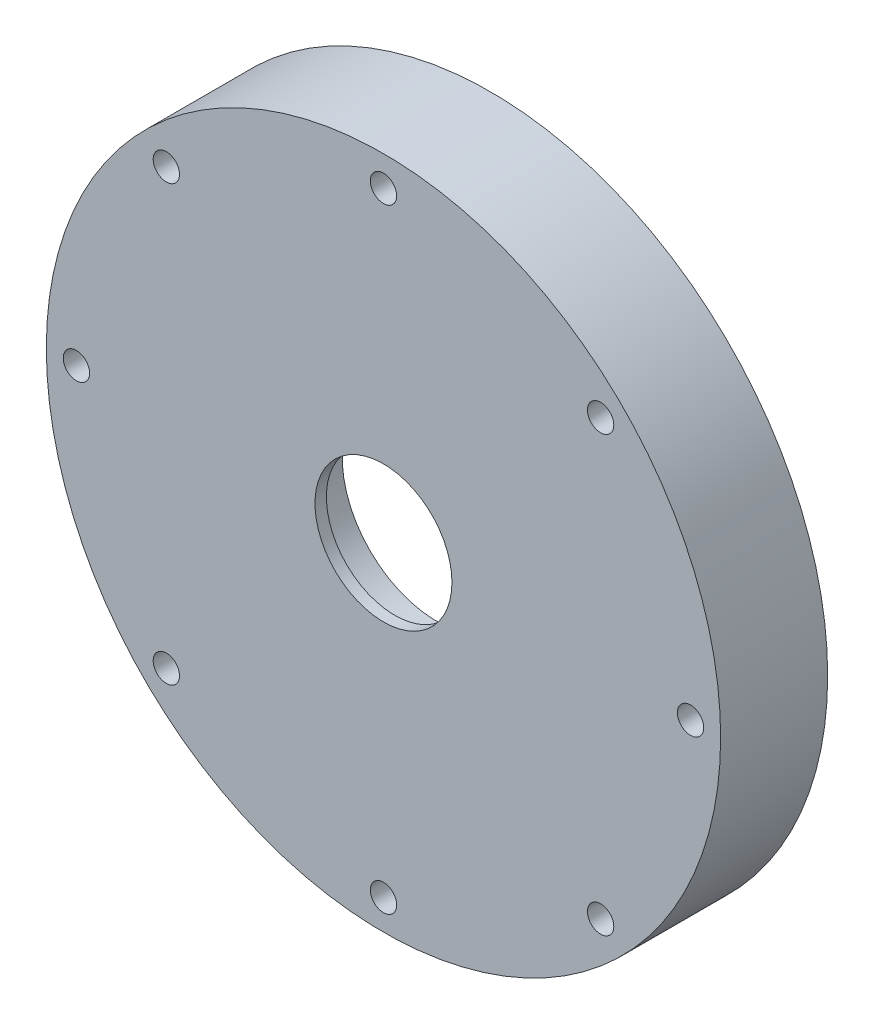
ISO-10303-21;
HEADER;
FILE_DESCRIPTION(('STEP AP214'),'2;1');
FILE_NAME('part.step','',(''),(''),'','','');
FILE_SCHEMA(('AUTOMOTIVE_DESIGN { 1 0 10303 214 1 1 1 1 }'));
ENDSEC;
DATA;
#1=APPLICATION_CONTEXT('core data for automotive mechanical design processes');
#2=APPLICATION_PROTOCOL_DEFINITION('international standard','automotive_design',2000,#1);
#3=PRODUCT_CONTEXT('',#1,'mechanical');
#4=PRODUCT('Part','Part','',(#3));
#5=PRODUCT_RELATED_PRODUCT_CATEGORY('part','',(#4));
#6=PRODUCT_DEFINITION_FORMATION('','',#4);
#7=PRODUCT_DEFINITION_CONTEXT('part definition',#1,'design');
#8=PRODUCT_DEFINITION('design','',#6,#7);
#9=PRODUCT_DEFINITION_SHAPE('','',#8);
#10=(LENGTH_UNIT() NAMED_UNIT(*) SI_UNIT(.MILLI.,.METRE.));
#11=(NAMED_UNIT(*) PLANE_ANGLE_UNIT() SI_UNIT($,.RADIAN.));
#12=(NAMED_UNIT(*) SI_UNIT($,.STERADIAN.) SOLID_ANGLE_UNIT());
#13=UNCERTAINTY_MEASURE_WITH_UNIT(LENGTH_MEASURE(1.E-05),#10,'distance_accuracy_value','');
#14=(GEOMETRIC_REPRESENTATION_CONTEXT(3) GLOBAL_UNCERTAINTY_ASSIGNED_CONTEXT((#13)) GLOBAL_UNIT_ASSIGNED_CONTEXT((#10,
#11,#12)) REPRESENTATION_CONTEXT('',''));
#15=CARTESIAN_POINT('',(0.,0.,0.));
#16=DIRECTION('',(0.,0.,1.));
#17=DIRECTION('',(1.,0.,0.));
#18=AXIS2_PLACEMENT_3D('',#15,#16,#17);
#19=CARTESIAN_POINT('',(0.,0.,-10.16));
#20=DIRECTION('',(0.,0.,1.));
#21=DIRECTION('',(-1.,0.,0.));
#22=AXIS2_PLACEMENT_3D('',#19,#20,#21);
#23=CYLINDRICAL_SURFACE('',#22,32.004);
#24=CARTESIAN_POINT('',(0.,0.,-10.16));
#25=DIRECTION('',(0.,0.,1.));
#26=DIRECTION('',(1.,0.,0.));
#27=AXIS2_PLACEMENT_3D('',#24,#25,#26);
#28=CIRCLE('',#27,32.004);
#29=CARTESIAN_POINT('',(32.004,0.,-10.16));
#30=VERTEX_POINT('',#29);
#31=EDGE_CURVE('E10',#30,#30,#28,.T.);
#32=ORIENTED_EDGE('',*,*,#31,.T.);
#33=EDGE_LOOP('',(#32));
#34=FACE_BOUND('',#33,.T.);
#35=CARTESIAN_POINT('',(0.,0.,0.));
#36=DIRECTION('',(0.,0.,1.));
#37=DIRECTION('',(1.,0.,0.));
#38=AXIS2_PLACEMENT_3D('',#35,#36,#37);
#39=CIRCLE('',#38,32.004);
#40=CARTESIAN_POINT('',(32.004,0.,0.));
#41=VERTEX_POINT('',#40);
#42=EDGE_CURVE('E48',#41,#41,#39,.T.);
#43=ORIENTED_EDGE('',*,*,#42,.F.);
#44=EDGE_LOOP('',(#43));
#45=FACE_BOUND('',#44,.T.);
#46=ADVANCED_FACE('F45',(#34,#45),#23,.T.);
#47=CARTESIAN_POINT('',(0.,0.,-10.16));
#48=DIRECTION('',(0.,0.,-1.));
#49=DIRECTION('',(1.,0.,0.));
#50=AXIS2_PLACEMENT_3D('',#47,#48,#49);
#51=PLANE('',#50);
#52=CARTESIAN_POINT('',(0.,29.1465,-10.16));
#53=DIRECTION('',(0.,0.,1.));
#54=DIRECTION('',(1.,0.,0.));
#55=AXIS2_PLACEMENT_3D('',#52,#53,#54);
#56=CIRCLE('',#55,1.25);
#57=CARTESIAN_POINT('',(1.25,29.1465,-10.16));
#58=VERTEX_POINT('',#57);
#59=EDGE_CURVE('E119',#58,#58,#56,.T.);
#60=ORIENTED_EDGE('',*,*,#59,.T.);
#61=EDGE_LOOP('',(#60));
#62=FACE_BOUND('',#61,.T.);
#63=CARTESIAN_POINT('',(20.6096877978537,20.6096877978537,-10.16));
#64=DIRECTION('',(0.,0.,1.));
#65=DIRECTION('',(1.,0.,0.));
#66=AXIS2_PLACEMENT_3D('',#63,#64,#65);
#67=CIRCLE('',#66,1.25);
#68=CARTESIAN_POINT('',(21.8596877978537,20.6096877978537,-10.16));
#69=VERTEX_POINT('',#68);
#70=EDGE_CURVE('E113',#69,#69,#67,.T.);
#71=ORIENTED_EDGE('',*,*,#70,.T.);
#72=EDGE_LOOP('',(#71));
#73=FACE_BOUND('',#72,.T.);
#74=CARTESIAN_POINT('',(29.1465,0.,-10.16));
#75=DIRECTION('',(0.,0.,1.));
#76=DIRECTION('',(1.,0.,0.));
#77=AXIS2_PLACEMENT_3D('',#74,#75,#76);
#78=CIRCLE('',#77,1.25);
#79=CARTESIAN_POINT('',(30.3965,0.,-10.16));
#80=VERTEX_POINT('',#79);
#81=EDGE_CURVE('E107',#80,#80,#78,.T.);
#82=ORIENTED_EDGE('',*,*,#81,.T.);
#83=EDGE_LOOP('',(#82));
#84=FACE_BOUND('',#83,.T.);
#85=CARTESIAN_POINT('',(20.6096877978537,-20.6096877978537,-10.16));
#86=DIRECTION('',(0.,0.,1.));
#87=DIRECTION('',(1.,0.,0.));
#88=AXIS2_PLACEMENT_3D('',#85,#86,#87);
#89=CIRCLE('',#88,1.25);
#90=CARTESIAN_POINT('',(21.8596877978537,-20.6096877978537,-10.16));
#91=VERTEX_POINT('',#90);
#92=EDGE_CURVE('E101',#91,#91,#89,.T.);
#93=ORIENTED_EDGE('',*,*,#92,.T.);
#94=EDGE_LOOP('',(#93));
#95=FACE_BOUND('',#94,.T.);
#96=CARTESIAN_POINT('',(0.,-29.1465,-10.16));
#97=DIRECTION('',(0.,0.,1.));
#98=DIRECTION('',(1.,0.,0.));
#99=AXIS2_PLACEMENT_3D('',#96,#97,#98);
#100=CIRCLE('',#99,1.25);
#101=CARTESIAN_POINT('',(1.25,-29.1465,-10.16));
#102=VERTEX_POINT('',#101);
#103=EDGE_CURVE('E95',#102,#102,#100,.T.);
#104=ORIENTED_EDGE('',*,*,#103,.T.);
#105=EDGE_LOOP('',(#104));
#106=FACE_BOUND('',#105,.T.);
#107=CARTESIAN_POINT('',(-20.6096877978537,-20.6096877978537,-10.16));
#108=DIRECTION('',(0.,0.,1.));
#109=DIRECTION('',(1.,0.,0.));
#110=AXIS2_PLACEMENT_3D('',#107,#108,#109);
#111=CIRCLE('',#110,1.25);
#112=CARTESIAN_POINT('',(-19.3596877978537,-20.6096877978537,-10.16));
#113=VERTEX_POINT('',#112);
#114=EDGE_CURVE('E89',#113,#113,#111,.T.);
#115=ORIENTED_EDGE('',*,*,#114,.T.);
#116=EDGE_LOOP('',(#115));
#117=FACE_BOUND('',#116,.T.);
#118=CARTESIAN_POINT('',(-29.1465,0.,-10.16));
#119=DIRECTION('',(0.,0.,1.));
#120=DIRECTION('',(1.,0.,0.));
#121=AXIS2_PLACEMENT_3D('',#118,#119,#120);
#122=CIRCLE('',#121,1.25);
#123=CARTESIAN_POINT('',(-27.8965,0.,-10.16));
#124=VERTEX_POINT('',#123);
#125=EDGE_CURVE('E83',#124,#124,#122,.T.);
#126=ORIENTED_EDGE('',*,*,#125,.T.);
#127=EDGE_LOOP('',(#126));
#128=FACE_BOUND('',#127,.T.);
#129=CARTESIAN_POINT('',(-20.6096877978537,20.6096877978537,-10.16));
#130=DIRECTION('',(0.,0.,1.));
#131=DIRECTION('',(1.,0.,0.));
#132=AXIS2_PLACEMENT_3D('',#129,#130,#131);
#133=CIRCLE('',#132,1.25);
#134=CARTESIAN_POINT('',(-19.3596877978537,20.6096877978537,-10.16));
#135=VERTEX_POINT('',#134);
#136=EDGE_CURVE('E77',#135,#135,#133,.T.);
#137=ORIENTED_EDGE('',*,*,#136,.T.);
#138=EDGE_LOOP('',(#137));
#139=FACE_BOUND('',#138,.T.);
#140=CARTESIAN_POINT('',(0.,0.,-10.16));
#141=DIRECTION('',(0.,0.,1.));
#142=DIRECTION('',(1.,0.,0.));
#143=AXIS2_PLACEMENT_3D('',#140,#141,#142);
#144=CIRCLE('',#143,25.4);
#145=CARTESIAN_POINT('',(25.4,0.,-10.16));
#146=VERTEX_POINT('',#145);
#147=EDGE_CURVE('E57',#146,#146,#144,.T.);
#148=ORIENTED_EDGE('',*,*,#147,.T.);
#149=EDGE_LOOP('',(#148));
#150=FACE_BOUND('',#149,.T.);
#151=ORIENTED_EDGE('',*,*,#31,.F.);
#152=EDGE_LOOP('',(#151));
#153=FACE_BOUND('',#152,.T.);
#154=ADVANCED_FACE('F123',(#62,#73,#84,#95,#106,#117,#128,#139,#150,#153),#51,.T.);
#155=CARTESIAN_POINT('',(0.,0.,0.));
#156=DIRECTION('',(0.,0.,-1.));
#157=DIRECTION('',(1.,0.,0.));
#158=AXIS2_PLACEMENT_3D('',#155,#156,#157);
#159=PLANE('',#158);
#160=CARTESIAN_POINT('',(0.,29.1465,0.));
#161=DIRECTION('',(0.,0.,1.));
#162=DIRECTION('',(1.,0.,0.));
#163=AXIS2_PLACEMENT_3D('',#160,#161,#162);
#164=CIRCLE('',#163,1.25);
#165=CARTESIAN_POINT('',(1.25,29.1465,0.));
#166=VERTEX_POINT('',#165);
#167=EDGE_CURVE('E116',#166,#166,#164,.T.);
#168=ORIENTED_EDGE('',*,*,#167,.F.);
#169=EDGE_LOOP('',(#168));
#170=FACE_BOUND('',#169,.T.);
#171=CARTESIAN_POINT('',(20.6096877978537,20.6096877978537,0.));
#172=DIRECTION('',(0.,0.,1.));
#173=DIRECTION('',(1.,0.,0.));
#174=AXIS2_PLACEMENT_3D('',#171,#172,#173);
#175=CIRCLE('',#174,1.25);
#176=CARTESIAN_POINT('',(21.8596877978537,20.6096877978537,0.));
#177=VERTEX_POINT('',#176);
#178=EDGE_CURVE('E110',#177,#177,#175,.T.);
#179=ORIENTED_EDGE('',*,*,#178,.F.);
#180=EDGE_LOOP('',(#179));
#181=FACE_BOUND('',#180,.T.);
#182=CARTESIAN_POINT('',(29.1465,0.,0.));
#183=DIRECTION('',(0.,0.,1.));
#184=DIRECTION('',(1.,0.,0.));
#185=AXIS2_PLACEMENT_3D('',#182,#183,#184);
#186=CIRCLE('',#185,1.25);
#187=CARTESIAN_POINT('',(30.3965,0.,0.));
#188=VERTEX_POINT('',#187);
#189=EDGE_CURVE('E104',#188,#188,#186,.T.);
#190=ORIENTED_EDGE('',*,*,#189,.F.);
#191=EDGE_LOOP('',(#190));
#192=FACE_BOUND('',#191,.T.);
#193=CARTESIAN_POINT('',(20.6096877978537,-20.6096877978537,0.));
#194=DIRECTION('',(0.,0.,1.));
#195=DIRECTION('',(1.,0.,0.));
#196=AXIS2_PLACEMENT_3D('',#193,#194,#195);
#197=CIRCLE('',#196,1.25);
#198=CARTESIAN_POINT('',(21.8596877978537,-20.6096877978537,0.));
#199=VERTEX_POINT('',#198);
#200=EDGE_CURVE('E98',#199,#199,#197,.T.);
#201=ORIENTED_EDGE('',*,*,#200,.F.);
#202=EDGE_LOOP('',(#201));
#203=FACE_BOUND('',#202,.T.);
#204=CARTESIAN_POINT('',(0.,-29.1465,0.));
#205=DIRECTION('',(0.,0.,1.));
#206=DIRECTION('',(1.,0.,0.));
#207=AXIS2_PLACEMENT_3D('',#204,#205,#206);
#208=CIRCLE('',#207,1.25);
#209=CARTESIAN_POINT('',(1.25,-29.1465,0.));
#210=VERTEX_POINT('',#209);
#211=EDGE_CURVE('E92',#210,#210,#208,.T.);
#212=ORIENTED_EDGE('',*,*,#211,.F.);
#213=EDGE_LOOP('',(#212));
#214=FACE_BOUND('',#213,.T.);
#215=CARTESIAN_POINT('',(-20.6096877978537,-20.6096877978537,0.));
#216=DIRECTION('',(0.,0.,1.));
#217=DIRECTION('',(1.,0.,0.));
#218=AXIS2_PLACEMENT_3D('',#215,#216,#217);
#219=CIRCLE('',#218,1.25);
#220=CARTESIAN_POINT('',(-19.3596877978537,-20.6096877978537,0.));
#221=VERTEX_POINT('',#220);
#222=EDGE_CURVE('E86',#221,#221,#219,.T.);
#223=ORIENTED_EDGE('',*,*,#222,.F.);
#224=EDGE_LOOP('',(#223));
#225=FACE_BOUND('',#224,.T.);
#226=CARTESIAN_POINT('',(-29.1465,0.,0.));
#227=DIRECTION('',(0.,0.,1.));
#228=DIRECTION('',(1.,0.,0.));
#229=AXIS2_PLACEMENT_3D('',#226,#227,#228);
#230=CIRCLE('',#229,1.25);
#231=CARTESIAN_POINT('',(-27.8965,0.,0.));
#232=VERTEX_POINT('',#231);
#233=EDGE_CURVE('E80',#232,#232,#230,.T.);
#234=ORIENTED_EDGE('',*,*,#233,.F.);
#235=EDGE_LOOP('',(#234));
#236=FACE_BOUND('',#235,.T.);
#237=CARTESIAN_POINT('',(-20.6096877978537,20.6096877978537,0.));
#238=DIRECTION('',(0.,0.,1.));
#239=DIRECTION('',(1.,0.,0.));
#240=AXIS2_PLACEMENT_3D('',#237,#238,#239);
#241=CIRCLE('',#240,1.25);
#242=CARTESIAN_POINT('',(-19.3596877978537,20.6096877978537,0.));
#243=VERTEX_POINT('',#242);
#244=EDGE_CURVE('E72',#243,#243,#241,.T.);
#245=ORIENTED_EDGE('',*,*,#244,.F.);
#246=EDGE_LOOP('',(#245));
#247=FACE_BOUND('',#246,.T.);
#248=CARTESIAN_POINT('',(0.,0.,0.));
#249=DIRECTION('',(0.,0.,1.));
#250=DIRECTION('',(1.,0.,0.));
#251=AXIS2_PLACEMENT_3D('',#248,#249,#250);
#252=CIRCLE('',#251,6.5);
#253=CARTESIAN_POINT('',(6.5,0.,0.));
#254=VERTEX_POINT('',#253);
#255=EDGE_CURVE('E66',#254,#254,#252,.T.);
#256=ORIENTED_EDGE('',*,*,#255,.F.);
#257=EDGE_LOOP('',(#256));
#258=FACE_BOUND('',#257,.T.);
#259=ORIENTED_EDGE('',*,*,#42,.T.);
#260=EDGE_LOOP('',(#259));
#261=FACE_BOUND('',#260,.T.);
#262=ADVANCED_FACE('F144',(#170,#181,#192,#203,#214,#225,#236,#247,#258,#261),#159,.F.);
#263=CARTESIAN_POINT('',(0.,0.,-5.08));
#264=DIRECTION('',(0.,0.,-1.));
#265=DIRECTION('',(1.,0.,0.));
#266=AXIS2_PLACEMENT_3D('',#263,#264,#265);
#267=CYLINDRICAL_SURFACE('',#266,25.4);
#268=CARTESIAN_POINT('',(0.,0.,-5.08));
#269=DIRECTION('',(0.,0.,1.));
#270=DIRECTION('',(1.,0.,0.));
#271=AXIS2_PLACEMENT_3D('',#268,#269,#270);
#272=CIRCLE('',#271,25.4);
#273=CARTESIAN_POINT('',(25.4,0.,-5.08));
#274=VERTEX_POINT('',#273);
#275=EDGE_CURVE('E55',#274,#274,#272,.T.);
#276=ORIENTED_EDGE('',*,*,#275,.T.);
#277=EDGE_LOOP('',(#276));
#278=FACE_BOUND('',#277,.T.);
#279=ORIENTED_EDGE('',*,*,#147,.F.);
#280=EDGE_LOOP('',(#279));
#281=FACE_BOUND('',#280,.T.);
#282=ADVANCED_FACE('F150',(#278,#281),#267,.F.);
#283=CARTESIAN_POINT('',(0.,0.,-5.08));
#284=DIRECTION('',(0.,0.,-1.));
#285=DIRECTION('',(1.,0.,0.));
#286=AXIS2_PLACEMENT_3D('',#283,#284,#285);
#287=PLANE('',#286);
#288=CARTESIAN_POINT('',(0.,0.,-5.08));
#289=DIRECTION('',(0.,0.,1.));
#290=DIRECTION('',(1.,0.,0.));
#291=AXIS2_PLACEMENT_3D('',#288,#289,#290);
#292=CIRCLE('',#291,9.);
#293=CARTESIAN_POINT('',(9.,0.,-5.08));
#294=VERTEX_POINT('',#293);
#295=EDGE_CURVE('E63',#294,#294,#292,.T.);
#296=ORIENTED_EDGE('',*,*,#295,.T.);
#297=EDGE_LOOP('',(#296));
#298=FACE_BOUND('',#297,.T.);
#299=ORIENTED_EDGE('',*,*,#275,.F.);
#300=EDGE_LOOP('',(#299));
#301=FACE_BOUND('',#300,.T.);
#302=ADVANCED_FACE('F155',(#298,#301),#287,.T.);
#303=CARTESIAN_POINT('',(0.,0.,-1.08));
#304=DIRECTION('',(0.,0.,-1.));
#305=DIRECTION('',(1.,0.,0.));
#306=AXIS2_PLACEMENT_3D('',#303,#304,#305);
#307=CYLINDRICAL_SURFACE('',#306,9.);
#308=CARTESIAN_POINT('',(0.,0.,-1.08));
#309=DIRECTION('',(0.,0.,1.));
#310=DIRECTION('',(1.,0.,0.));
#311=AXIS2_PLACEMENT_3D('',#308,#309,#310);
#312=CIRCLE('',#311,9.);
#313=CARTESIAN_POINT('',(9.,0.,-1.08));
#314=VERTEX_POINT('',#313);
#315=EDGE_CURVE('E60',#314,#314,#312,.T.);
#316=ORIENTED_EDGE('',*,*,#315,.T.);
#317=EDGE_LOOP('',(#316));
#318=FACE_BOUND('',#317,.T.);
#319=ORIENTED_EDGE('',*,*,#295,.F.);
#320=EDGE_LOOP('',(#319));
#321=FACE_BOUND('',#320,.T.);
#322=ADVANCED_FACE('F163',(#318,#321),#307,.F.);
#323=CARTESIAN_POINT('',(0.,0.,-1.08));
#324=DIRECTION('',(0.,0.,-1.));
#325=DIRECTION('',(1.,0.,0.));
#326=AXIS2_PLACEMENT_3D('',#323,#324,#325);
#327=PLANE('',#326);
#328=CARTESIAN_POINT('',(0.,0.,-1.08));
#329=DIRECTION('',(0.,0.,1.));
#330=DIRECTION('',(1.,0.,0.));
#331=AXIS2_PLACEMENT_3D('',#328,#329,#330);
#332=CIRCLE('',#331,6.5);
#333=CARTESIAN_POINT('',(6.5,0.,-1.08));
#334=VERTEX_POINT('',#333);
#335=EDGE_CURVE('E69',#334,#334,#332,.T.);
#336=ORIENTED_EDGE('',*,*,#335,.T.);
#337=EDGE_LOOP('',(#336));
#338=FACE_BOUND('',#337,.T.);
#339=ORIENTED_EDGE('',*,*,#315,.F.);
#340=EDGE_LOOP('',(#339));
#341=FACE_BOUND('',#340,.T.);
#342=ADVANCED_FACE('F167',(#338,#341),#327,.T.);
#343=CARTESIAN_POINT('',(0.,0.,0.));
#344=DIRECTION('',(0.,0.,-1.));
#345=DIRECTION('',(1.,0.,0.));
#346=AXIS2_PLACEMENT_3D('',#343,#344,#345);
#347=CYLINDRICAL_SURFACE('',#346,6.5);
#348=ORIENTED_EDGE('',*,*,#255,.T.);
#349=EDGE_LOOP('',(#348));
#350=FACE_BOUND('',#349,.T.);
#351=ORIENTED_EDGE('',*,*,#335,.F.);
#352=EDGE_LOOP('',(#351));
#353=FACE_BOUND('',#352,.T.);
#354=ADVANCED_FACE('F171',(#350,#353),#347,.F.);
#355=CARTESIAN_POINT('',(-20.6096877978537,20.6096877978537,-10.16));
#356=DIRECTION('',(0.,0.,-1.));
#357=DIRECTION('',(1.,0.,0.));
#358=AXIS2_PLACEMENT_3D('',#355,#356,#357);
#359=CYLINDRICAL_SURFACE('',#358,1.25);
#360=ORIENTED_EDGE('',*,*,#244,.T.);
#361=EDGE_LOOP('',(#360));
#362=FACE_BOUND('',#361,.T.);
#363=ORIENTED_EDGE('',*,*,#136,.F.);
#364=EDGE_LOOP('',(#363));
#365=FACE_BOUND('',#364,.T.);
#366=ADVANCED_FACE('F175',(#362,#365),#359,.F.);
#367=CARTESIAN_POINT('',(-29.1465,0.,-10.16));
#368=DIRECTION('',(0.,0.,-1.));
#369=DIRECTION('',(1.,0.,0.));
#370=AXIS2_PLACEMENT_3D('',#367,#368,#369);
#371=CYLINDRICAL_SURFACE('',#370,1.25);
#372=ORIENTED_EDGE('',*,*,#233,.T.);
#373=EDGE_LOOP('',(#372));
#374=FACE_BOUND('',#373,.T.);
#375=ORIENTED_EDGE('',*,*,#125,.F.);
#376=EDGE_LOOP('',(#375));
#377=FACE_BOUND('',#376,.T.);
#378=ADVANCED_FACE('F179',(#374,#377),#371,.F.);
#379=CARTESIAN_POINT('',(-20.6096877978537,-20.6096877978537,-10.16));
#380=DIRECTION('',(0.,0.,-1.));
#381=DIRECTION('',(1.,0.,0.));
#382=AXIS2_PLACEMENT_3D('',#379,#380,#381);
#383=CYLINDRICAL_SURFACE('',#382,1.25);
#384=ORIENTED_EDGE('',*,*,#222,.T.);
#385=EDGE_LOOP('',(#384));
#386=FACE_BOUND('',#385,.T.);
#387=ORIENTED_EDGE('',*,*,#114,.F.);
#388=EDGE_LOOP('',(#387));
#389=FACE_BOUND('',#388,.T.);
#390=ADVANCED_FACE('F183',(#386,#389),#383,.F.);
#391=CARTESIAN_POINT('',(0.,-29.1465,-10.16));
#392=DIRECTION('',(0.,0.,-1.));
#393=DIRECTION('',(1.,0.,0.));
#394=AXIS2_PLACEMENT_3D('',#391,#392,#393);
#395=CYLINDRICAL_SURFACE('',#394,1.25);
#396=ORIENTED_EDGE('',*,*,#211,.T.);
#397=EDGE_LOOP('',(#396));
#398=FACE_BOUND('',#397,.T.);
#399=ORIENTED_EDGE('',*,*,#103,.F.);
#400=EDGE_LOOP('',(#399));
#401=FACE_BOUND('',#400,.T.);
#402=ADVANCED_FACE('F187',(#398,#401),#395,.F.);
#403=CARTESIAN_POINT('',(20.6096877978537,-20.6096877978537,-10.16));
#404=DIRECTION('',(0.,0.,-1.));
#405=DIRECTION('',(1.,0.,0.));
#406=AXIS2_PLACEMENT_3D('',#403,#404,#405);
#407=CYLINDRICAL_SURFACE('',#406,1.25);
#408=ORIENTED_EDGE('',*,*,#200,.T.);
#409=EDGE_LOOP('',(#408));
#410=FACE_BOUND('',#409,.T.);
#411=ORIENTED_EDGE('',*,*,#92,.F.);
#412=EDGE_LOOP('',(#411));
#413=FACE_BOUND('',#412,.T.);
#414=ADVANCED_FACE('F191',(#410,#413),#407,.F.);
#415=CARTESIAN_POINT('',(29.1465,0.,-10.16));
#416=DIRECTION('',(0.,0.,-1.));
#417=DIRECTION('',(1.,0.,0.));
#418=AXIS2_PLACEMENT_3D('',#415,#416,#417);
#419=CYLINDRICAL_SURFACE('',#418,1.25);
#420=ORIENTED_EDGE('',*,*,#189,.T.);
#421=EDGE_LOOP('',(#420));
#422=FACE_BOUND('',#421,.T.);
#423=ORIENTED_EDGE('',*,*,#81,.F.);
#424=EDGE_LOOP('',(#423));
#425=FACE_BOUND('',#424,.T.);
#426=ADVANCED_FACE('F136',(#422,#425),#419,.F.);
#427=CARTESIAN_POINT('',(20.6096877978537,20.6096877978537,-10.16));
#428=DIRECTION('',(0.,0.,-1.));
#429=DIRECTION('',(1.,0.,0.));
#430=AXIS2_PLACEMENT_3D('',#427,#428,#429);
#431=CYLINDRICAL_SURFACE('',#430,1.25);
#432=ORIENTED_EDGE('',*,*,#178,.T.);
#433=EDGE_LOOP('',(#432));
#434=FACE_BOUND('',#433,.T.);
#435=ORIENTED_EDGE('',*,*,#70,.F.);
#436=EDGE_LOOP('',(#435));
#437=FACE_BOUND('',#436,.T.);
#438=ADVANCED_FACE('F128',(#434,#437),#431,.F.);
#439=CARTESIAN_POINT('',(0.,29.1465,-10.16));
#440=DIRECTION('',(0.,0.,-1.));
#441=DIRECTION('',(1.,0.,0.));
#442=AXIS2_PLACEMENT_3D('',#439,#440,#441);
#443=CYLINDRICAL_SURFACE('',#442,1.25);
#444=ORIENTED_EDGE('',*,*,#167,.T.);
#445=EDGE_LOOP('',(#444));
#446=FACE_BOUND('',#445,.T.);
#447=ORIENTED_EDGE('',*,*,#59,.F.);
#448=EDGE_LOOP('',(#447));
#449=FACE_BOUND('',#448,.T.);
#450=ADVANCED_FACE('F126',(#446,#449),#443,.F.);
#451=CLOSED_SHELL('',(#46,#154,#262,#282,#302,#322,#342,#354,#366,#378,#390,#402,#414,#426,#438,#450));
#452=MANIFOLD_SOLID_BREP('B2',#451);
#453=ADVANCED_BREP_SHAPE_REPRESENTATION('',(#18,#452),#14);
#454=SHAPE_DEFINITION_REPRESENTATION(#9,#453);
ENDSEC;
END-ISO-10303-21;
